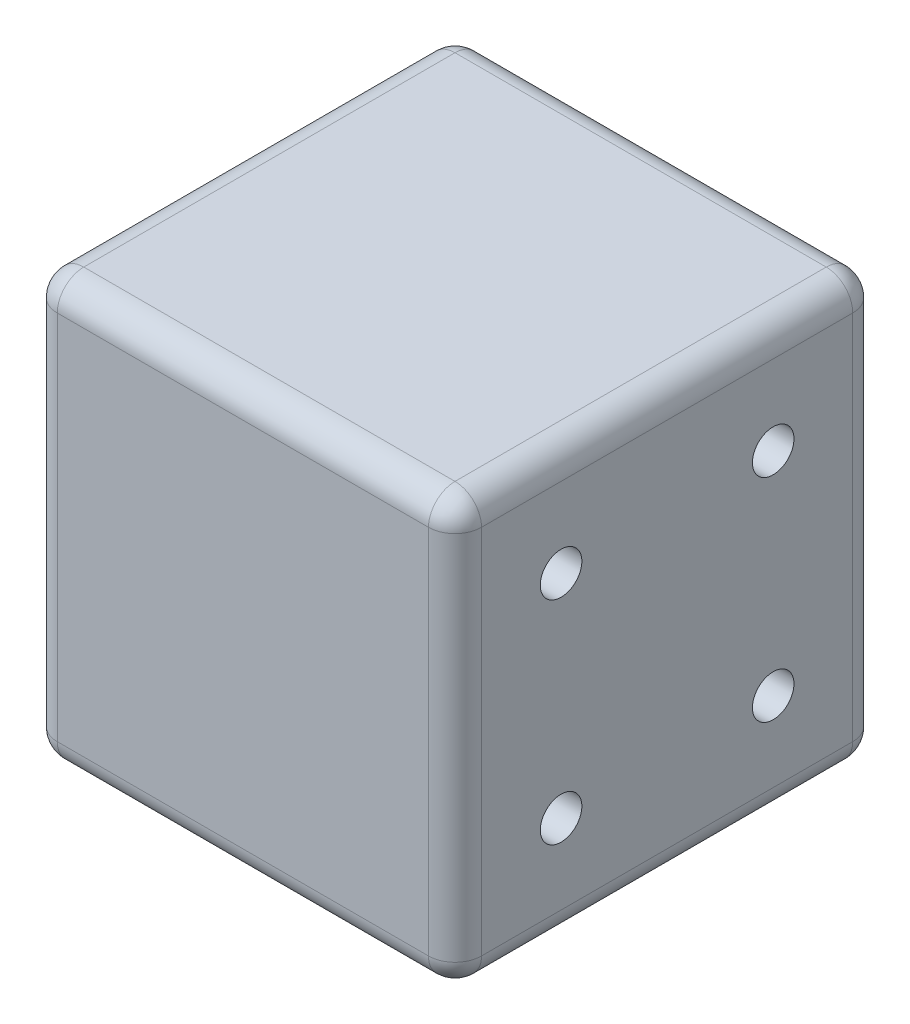
ISO-10303-21;
HEADER;
FILE_DESCRIPTION(('STEP AP214'),'2;1');
FILE_NAME('part.step','',(''),(''),'','','');
FILE_SCHEMA(('AUTOMOTIVE_DESIGN { 1 0 10303 214 1 1 1 1 }'));
ENDSEC;
DATA;
#1=APPLICATION_CONTEXT('core data for automotive mechanical design processes');
#2=APPLICATION_PROTOCOL_DEFINITION('international standard','automotive_design',2000,#1);
#3=PRODUCT_CONTEXT('',#1,'mechanical');
#4=PRODUCT('Part','Part','',(#3));
#5=PRODUCT_RELATED_PRODUCT_CATEGORY('part','',(#4));
#6=PRODUCT_DEFINITION_FORMATION('','',#4);
#7=PRODUCT_DEFINITION_CONTEXT('part definition',#1,'design');
#8=PRODUCT_DEFINITION('design','',#6,#7);
#9=PRODUCT_DEFINITION_SHAPE('','',#8);
#10=(LENGTH_UNIT() NAMED_UNIT(*) SI_UNIT(.MILLI.,.METRE.));
#11=(NAMED_UNIT(*) PLANE_ANGLE_UNIT() SI_UNIT($,.RADIAN.));
#12=(NAMED_UNIT(*) SI_UNIT($,.STERADIAN.) SOLID_ANGLE_UNIT());
#13=UNCERTAINTY_MEASURE_WITH_UNIT(LENGTH_MEASURE(1.E-05),#10,'distance_accuracy_value','');
#14=(GEOMETRIC_REPRESENTATION_CONTEXT(3) GLOBAL_UNCERTAINTY_ASSIGNED_CONTEXT((#13)) GLOBAL_UNIT_ASSIGNED_CONTEXT((#10,
#11,#12)) REPRESENTATION_CONTEXT('',''));
#15=CARTESIAN_POINT('',(0.,0.,0.));
#16=DIRECTION('',(0.,0.,1.));
#17=DIRECTION('',(1.,0.,0.));
#18=AXIS2_PLACEMENT_3D('',#15,#16,#17);
#19=CARTESIAN_POINT('',(0.,0.,-50.8));
#20=DIRECTION('',(-1.,0.,0.));
#21=DIRECTION('',(0.,0.,1.));
#22=AXIS2_PLACEMENT_3D('',#19,#20,#21);
#23=PLANE('',#22);
#24=CARTESIAN_POINT('',(0.,38.1,-38.1));
#25=DIRECTION('',(-1.,0.,0.));
#26=DIRECTION('',(0.,0.,1.));
#27=AXIS2_PLACEMENT_3D('',#24,#25,#26);
#28=CIRCLE('',#27,2.4892);
#29=CARTESIAN_POINT('',(0.,38.1,-35.6108));
#30=VERTEX_POINT('',#29);
#31=EDGE_CURVE('E428',#30,#30,#28,.T.);
#32=ORIENTED_EDGE('',*,*,#31,.F.);
#33=EDGE_LOOP('',(#32));
#34=FACE_BOUND('',#33,.T.);
#35=CARTESIAN_POINT('',(0.,38.1,-12.7));
#36=DIRECTION('',(-1.,0.,0.));
#37=DIRECTION('',(0.,0.,1.));
#38=AXIS2_PLACEMENT_3D('',#35,#36,#37);
#39=CIRCLE('',#38,2.4892);
#40=CARTESIAN_POINT('',(0.,38.1,-10.2108));
#41=VERTEX_POINT('',#40);
#42=EDGE_CURVE('E420',#41,#41,#39,.T.);
#43=ORIENTED_EDGE('',*,*,#42,.F.);
#44=EDGE_LOOP('',(#43));
#45=FACE_BOUND('',#44,.T.);
#46=CARTESIAN_POINT('',(0.,12.7,-12.7));
#47=DIRECTION('',(-1.,0.,0.));
#48=DIRECTION('',(0.,0.,1.));
#49=AXIS2_PLACEMENT_3D('',#46,#47,#48);
#50=CIRCLE('',#49,2.4892);
#51=CARTESIAN_POINT('',(0.,12.7,-10.2108));
#52=VERTEX_POINT('',#51);
#53=EDGE_CURVE('E416',#52,#52,#50,.T.);
#54=ORIENTED_EDGE('',*,*,#53,.F.);
#55=EDGE_LOOP('',(#54));
#56=FACE_BOUND('',#55,.T.);
#57=CARTESIAN_POINT('',(0.,12.7,-38.1));
#58=DIRECTION('',(-1.,0.,0.));
#59=DIRECTION('',(0.,0.,1.));
#60=AXIS2_PLACEMENT_3D('',#57,#58,#59);
#61=CIRCLE('',#60,2.4892);
#62=CARTESIAN_POINT('',(0.,12.7,-35.6108));
#63=VERTEX_POINT('',#62);
#64=EDGE_CURVE('E171',#63,#63,#61,.T.);
#65=ORIENTED_EDGE('',*,*,#64,.F.);
#66=EDGE_LOOP('',(#65));
#67=FACE_BOUND('',#66,.T.);
#68=DIRECTION('',(0.,-1.,0.));
#69=VECTOR('',#68,1.);
#70=CARTESIAN_POINT('',(0.,0.,-47.625));
#71=LINE('',#70,#69);
#72=CARTESIAN_POINT('',(0.,47.625,-47.625));
#73=VERTEX_POINT('',#72);
#74=CARTESIAN_POINT('',(0.,3.175,-47.625));
#75=VERTEX_POINT('',#74);
#76=EDGE_CURVE('E179',#73,#75,#71,.T.);
#77=ORIENTED_EDGE('',*,*,#76,.T.);
#78=DIRECTION('',(0.,0.,1.));
#79=VECTOR('',#78,1.);
#80=CARTESIAN_POINT('',(0.,3.175,-50.8));
#81=LINE('',#80,#79);
#82=CARTESIAN_POINT('',(0.,3.175,-3.175));
#83=VERTEX_POINT('',#82);
#84=EDGE_CURVE('E184',#75,#83,#81,.T.);
#85=ORIENTED_EDGE('',*,*,#84,.T.);
#86=DIRECTION('',(0.,-1.,0.));
#87=VECTOR('',#86,1.);
#88=CARTESIAN_POINT('',(0.,50.8,-3.175));
#89=LINE('',#88,#87);
#90=CARTESIAN_POINT('',(0.,47.625,-3.175));
#91=VERTEX_POINT('',#90);
#92=EDGE_CURVE('E181',#83,#91,#89,.F.);
#93=ORIENTED_EDGE('',*,*,#92,.T.);
#94=DIRECTION('',(0.,0.,1.));
#95=VECTOR('',#94,1.);
#96=CARTESIAN_POINT('',(0.,47.625,-50.8));
#97=LINE('',#96,#95);
#98=EDGE_CURVE('E177',#91,#73,#97,.F.);
#99=ORIENTED_EDGE('',*,*,#98,.T.);
#100=EDGE_LOOP('',(#77,#85,#93,#99));
#101=FACE_BOUND('',#100,.T.);
#102=ADVANCED_FACE('F39',(#34,#45,#56,#67,#101),#23,.T.);
#103=CARTESIAN_POINT('',(0.,50.8,-50.8));
#104=DIRECTION('',(0.,1.,0.));
#105=DIRECTION('',(0.,0.,1.));
#106=AXIS2_PLACEMENT_3D('',#103,#104,#105);
#107=PLANE('',#106);
#108=DIRECTION('',(0.,0.,1.));
#109=VECTOR('',#108,1.);
#110=CARTESIAN_POINT('',(47.625,50.8,-50.8));
#111=LINE('',#110,#109);
#112=CARTESIAN_POINT('',(47.625,50.8,-3.175));
#113=VERTEX_POINT('',#112);
#114=CARTESIAN_POINT('',(47.625,50.8,-47.625));
#115=VERTEX_POINT('',#114);
#116=EDGE_CURVE('E48',#113,#115,#111,.F.);
#117=ORIENTED_EDGE('',*,*,#116,.T.);
#118=DIRECTION('',(-1.,0.,0.));
#119=VECTOR('',#118,1.);
#120=CARTESIAN_POINT('',(0.,50.8,-47.625));
#121=LINE('',#120,#119);
#122=CARTESIAN_POINT('',(3.175,50.8,-47.625));
#123=VERTEX_POINT('',#122);
#124=EDGE_CURVE('E11',#115,#123,#121,.T.);
#125=ORIENTED_EDGE('',*,*,#124,.T.);
#126=DIRECTION('',(0.,0.,1.));
#127=VECTOR('',#126,1.);
#128=CARTESIAN_POINT('',(3.175,50.8,-50.8));
#129=LINE('',#128,#127);
#130=CARTESIAN_POINT('',(3.175,50.8,-3.175));
#131=VERTEX_POINT('',#130);
#132=EDGE_CURVE('E62',#123,#131,#129,.T.);
#133=ORIENTED_EDGE('',*,*,#132,.T.);
#134=DIRECTION('',(-1.,0.,0.));
#135=VECTOR('',#134,1.);
#136=CARTESIAN_POINT('',(50.8,50.8,-3.175));
#137=LINE('',#136,#135);
#138=EDGE_CURVE('E211',#131,#113,#137,.F.);
#139=ORIENTED_EDGE('',*,*,#138,.T.);
#140=EDGE_LOOP('',(#117,#125,#133,#139));
#141=FACE_BOUND('',#140,.T.);
#142=ADVANCED_FACE('F310',(#141),#107,.T.);
#143=CARTESIAN_POINT('',(50.8,0.,-50.8));
#144=DIRECTION('',(1.,0.,0.));
#145=DIRECTION('',(0.,1.,0.));
#146=AXIS2_PLACEMENT_3D('',#143,#144,#145);
#147=PLANE('',#146);
#148=CARTESIAN_POINT('',(50.8,38.1,-38.1));
#149=DIRECTION('',(-1.,0.,0.));
#150=DIRECTION('',(0.,0.,1.));
#151=AXIS2_PLACEMENT_3D('',#148,#149,#150);
#152=CIRCLE('',#151,2.4892);
#153=CARTESIAN_POINT('',(50.8,38.1,-35.6108));
#154=VERTEX_POINT('',#153);
#155=EDGE_CURVE('E431',#154,#154,#152,.T.);
#156=ORIENTED_EDGE('',*,*,#155,.T.);
#157=EDGE_LOOP('',(#156));
#158=FACE_BOUND('',#157,.T.);
#159=CARTESIAN_POINT('',(50.8,38.1,-12.7));
#160=DIRECTION('',(-1.,0.,0.));
#161=DIRECTION('',(0.,0.,1.));
#162=AXIS2_PLACEMENT_3D('',#159,#160,#161);
#163=CIRCLE('',#162,2.4892);
#164=CARTESIAN_POINT('',(50.8,38.1,-10.2108));
#165=VERTEX_POINT('',#164);
#166=EDGE_CURVE('E425',#165,#165,#163,.T.);
#167=ORIENTED_EDGE('',*,*,#166,.T.);
#168=EDGE_LOOP('',(#167));
#169=FACE_BOUND('',#168,.T.);
#170=CARTESIAN_POINT('',(50.8,12.7,-12.7));
#171=DIRECTION('',(-1.,0.,0.));
#172=DIRECTION('',(0.,0.,1.));
#173=AXIS2_PLACEMENT_3D('',#170,#171,#172);
#174=CIRCLE('',#173,2.4892);
#175=CARTESIAN_POINT('',(50.8,12.7,-10.2108));
#176=VERTEX_POINT('',#175);
#177=EDGE_CURVE('E413',#176,#176,#174,.T.);
#178=ORIENTED_EDGE('',*,*,#177,.T.);
#179=EDGE_LOOP('',(#178));
#180=FACE_BOUND('',#179,.T.);
#181=CARTESIAN_POINT('',(50.8,12.7,-38.1));
#182=DIRECTION('',(-1.,0.,0.));
#183=DIRECTION('',(0.,0.,1.));
#184=AXIS2_PLACEMENT_3D('',#181,#182,#183);
#185=CIRCLE('',#184,2.4892);
#186=CARTESIAN_POINT('',(50.8,12.7,-35.6108));
#187=VERTEX_POINT('',#186);
#188=EDGE_CURVE('E218',#187,#187,#185,.T.);
#189=ORIENTED_EDGE('',*,*,#188,.T.);
#190=EDGE_LOOP('',(#189));
#191=FACE_BOUND('',#190,.T.);
#192=DIRECTION('',(0.,1.,0.));
#193=VECTOR('',#192,1.);
#194=CARTESIAN_POINT('',(50.8,0.,-3.175));
#195=LINE('',#194,#193);
#196=CARTESIAN_POINT('',(50.8,47.625,-3.175));
#197=VERTEX_POINT('',#196);
#198=CARTESIAN_POINT('',(50.8,3.175,-3.175));
#199=VERTEX_POINT('',#198);
#200=EDGE_CURVE('E148',#197,#199,#195,.F.);
#201=ORIENTED_EDGE('',*,*,#200,.T.);
#202=DIRECTION('',(0.,0.,1.));
#203=VECTOR('',#202,1.);
#204=CARTESIAN_POINT('',(50.8,3.175,-50.8));
#205=LINE('',#204,#203);
#206=CARTESIAN_POINT('',(50.8,3.175,-47.625));
#207=VERTEX_POINT('',#206);
#208=EDGE_CURVE('E200',#199,#207,#205,.F.);
#209=ORIENTED_EDGE('',*,*,#208,.T.);
#210=DIRECTION('',(0.,1.,0.));
#211=VECTOR('',#210,1.);
#212=CARTESIAN_POINT('',(50.8,0.,-47.625));
#213=LINE('',#212,#211);
#214=CARTESIAN_POINT('',(50.8,47.625,-47.625));
#215=VERTEX_POINT('',#214);
#216=EDGE_CURVE('E197',#207,#215,#213,.T.);
#217=ORIENTED_EDGE('',*,*,#216,.T.);
#218=DIRECTION('',(0.,0.,1.));
#219=VECTOR('',#218,1.);
#220=CARTESIAN_POINT('',(50.8,47.625,-50.8));
#221=LINE('',#220,#219);
#222=EDGE_CURVE('E195',#215,#197,#221,.T.);
#223=ORIENTED_EDGE('',*,*,#222,.T.);
#224=EDGE_LOOP('',(#201,#209,#217,#223));
#225=FACE_BOUND('',#224,.T.);
#226=ADVANCED_FACE('F308',(#158,#169,#180,#191,#225),#147,.T.);
#227=CARTESIAN_POINT('',(0.,0.,-50.8));
#228=DIRECTION('',(0.,-1.,0.));
#229=DIRECTION('',(0.,0.,-1.));
#230=AXIS2_PLACEMENT_3D('',#227,#228,#229);
#231=PLANE('',#230);
#232=DIRECTION('',(1.,0.,0.));
#233=VECTOR('',#232,1.);
#234=CARTESIAN_POINT('',(0.,0.,-3.175));
#235=LINE('',#234,#233);
#236=CARTESIAN_POINT('',(47.625,0.,-3.175));
#237=VERTEX_POINT('',#236);
#238=CARTESIAN_POINT('',(3.175,0.,-3.175));
#239=VERTEX_POINT('',#238);
#240=EDGE_CURVE('E190',#237,#239,#235,.F.);
#241=ORIENTED_EDGE('',*,*,#240,.T.);
#242=DIRECTION('',(0.,0.,1.));
#243=VECTOR('',#242,1.);
#244=CARTESIAN_POINT('',(3.175,0.,-50.8));
#245=LINE('',#244,#243);
#246=CARTESIAN_POINT('',(3.175,0.,-47.625));
#247=VERTEX_POINT('',#246);
#248=EDGE_CURVE('E193',#239,#247,#245,.F.);
#249=ORIENTED_EDGE('',*,*,#248,.T.);
#250=DIRECTION('',(1.,0.,0.));
#251=VECTOR('',#250,1.);
#252=CARTESIAN_POINT('',(0.,0.,-47.625));
#253=LINE('',#252,#251);
#254=CARTESIAN_POINT('',(47.625,0.,-47.625));
#255=VERTEX_POINT('',#254);
#256=EDGE_CURVE('E188',#247,#255,#253,.T.);
#257=ORIENTED_EDGE('',*,*,#256,.T.);
#258=DIRECTION('',(0.,0.,1.));
#259=VECTOR('',#258,1.);
#260=CARTESIAN_POINT('',(47.625,0.,-50.8));
#261=LINE('',#260,#259);
#262=EDGE_CURVE('E186',#255,#237,#261,.T.);
#263=ORIENTED_EDGE('',*,*,#262,.T.);
#264=EDGE_LOOP('',(#241,#249,#257,#263));
#265=FACE_BOUND('',#264,.T.);
#266=ADVANCED_FACE('F277',(#265),#231,.T.);
#267=CARTESIAN_POINT('',(0.,0.,-50.8));
#268=DIRECTION('',(0.,0.,-1.));
#269=DIRECTION('',(-1.,0.,0.));
#270=AXIS2_PLACEMENT_3D('',#267,#268,#269);
#271=PLANE('',#270);
#272=DIRECTION('',(1.,0.,0.));
#273=VECTOR('',#272,1.);
#274=CARTESIAN_POINT('',(0.,3.175,-50.8));
#275=LINE('',#274,#273);
#276=CARTESIAN_POINT('',(47.625,3.175,-50.8));
#277=VERTEX_POINT('',#276);
#278=CARTESIAN_POINT('',(3.175,3.175,-50.8));
#279=VERTEX_POINT('',#278);
#280=EDGE_CURVE('E206',#277,#279,#275,.F.);
#281=ORIENTED_EDGE('',*,*,#280,.T.);
#282=DIRECTION('',(0.,-1.,0.));
#283=VECTOR('',#282,1.);
#284=CARTESIAN_POINT('',(3.175,0.,-50.8));
#285=LINE('',#284,#283);
#286=CARTESIAN_POINT('',(3.175,47.625,-50.8));
#287=VERTEX_POINT('',#286);
#288=EDGE_CURVE('E208',#279,#287,#285,.F.);
#289=ORIENTED_EDGE('',*,*,#288,.T.);
#290=DIRECTION('',(-1.,0.,0.));
#291=VECTOR('',#290,1.);
#292=CARTESIAN_POINT('',(0.,47.625,-50.8));
#293=LINE('',#292,#291);
#294=CARTESIAN_POINT('',(47.625,47.625,-50.8));
#295=VERTEX_POINT('',#294);
#296=EDGE_CURVE('E202',#287,#295,#293,.F.);
#297=ORIENTED_EDGE('',*,*,#296,.T.);
#298=DIRECTION('',(0.,1.,0.));
#299=VECTOR('',#298,1.);
#300=CARTESIAN_POINT('',(47.625,0.,-50.8));
#301=LINE('',#300,#299);
#302=EDGE_CURVE('E204',#295,#277,#301,.F.);
#303=ORIENTED_EDGE('',*,*,#302,.T.);
#304=EDGE_LOOP('',(#281,#289,#297,#303));
#305=FACE_BOUND('',#304,.T.);
#306=ADVANCED_FACE('F286',(#305),#271,.T.);
#307=CARTESIAN_POINT('',(0.,0.,0.));
#308=DIRECTION('',(0.,0.,-1.));
#309=DIRECTION('',(-1.,0.,0.));
#310=AXIS2_PLACEMENT_3D('',#307,#308,#309);
#311=PLANE('',#310);
#312=DIRECTION('',(-1.,0.,0.));
#313=VECTOR('',#312,1.);
#314=CARTESIAN_POINT('',(0.,47.625,0.));
#315=LINE('',#314,#313);
#316=CARTESIAN_POINT('',(47.625,47.625,0.));
#317=VERTEX_POINT('',#316);
#318=CARTESIAN_POINT('',(3.175,47.625,0.));
#319=VERTEX_POINT('',#318);
#320=EDGE_CURVE('E134',#317,#319,#315,.T.);
#321=ORIENTED_EDGE('',*,*,#320,.T.);
#322=DIRECTION('',(0.,-1.,0.));
#323=VECTOR('',#322,1.);
#324=CARTESIAN_POINT('',(3.175,0.,0.));
#325=LINE('',#324,#323);
#326=CARTESIAN_POINT('',(3.175,3.175,0.));
#327=VERTEX_POINT('',#326);
#328=EDGE_CURVE('E175',#319,#327,#325,.T.);
#329=ORIENTED_EDGE('',*,*,#328,.T.);
#330=DIRECTION('',(1.,0.,0.));
#331=VECTOR('',#330,1.);
#332=CARTESIAN_POINT('',(50.8,3.175,0.));
#333=LINE('',#332,#331);
#334=CARTESIAN_POINT('',(47.625,3.175,0.));
#335=VERTEX_POINT('',#334);
#336=EDGE_CURVE('E137',#327,#335,#333,.T.);
#337=ORIENTED_EDGE('',*,*,#336,.T.);
#338=DIRECTION('',(0.,1.,0.));
#339=VECTOR('',#338,1.);
#340=CARTESIAN_POINT('',(47.625,50.8,0.));
#341=LINE('',#340,#339);
#342=EDGE_CURVE('E129',#335,#317,#341,.T.);
#343=ORIENTED_EDGE('',*,*,#342,.T.);
#344=EDGE_LOOP('',(#321,#329,#337,#343));
#345=FACE_BOUND('',#344,.T.);
#346=ADVANCED_FACE('F131',(#345),#311,.F.);
#347=CARTESIAN_POINT('',(47.625,0.,-47.625));
#348=DIRECTION('',(0.,1.,0.));
#349=DIRECTION('',(-1.,0.,0.));
#350=AXIS2_PLACEMENT_3D('',#347,#348,#349);
#351=CYLINDRICAL_SURFACE('',#350,3.175);
#352=CARTESIAN_POINT('',(47.625,47.625,-47.625));
#353=DIRECTION('',(0.,1.,0.));
#354=DIRECTION('',(0.,0.,1.));
#355=AXIS2_PLACEMENT_3D('',#352,#353,#354);
#356=CIRCLE('',#355,3.175);
#357=EDGE_CURVE('E43',#215,#295,#356,.T.);
#358=ORIENTED_EDGE('',*,*,#357,.F.);
#359=ORIENTED_EDGE('',*,*,#216,.F.);
#360=CARTESIAN_POINT('',(47.625,3.175,-47.625));
#361=DIRECTION('',(0.,-1.,0.));
#362=DIRECTION('',(1.,0.,0.));
#363=AXIS2_PLACEMENT_3D('',#360,#361,#362);
#364=CIRCLE('',#363,3.175);
#365=EDGE_CURVE('E169',#277,#207,#364,.T.);
#366=ORIENTED_EDGE('',*,*,#365,.F.);
#367=ORIENTED_EDGE('',*,*,#302,.F.);
#368=EDGE_LOOP('',(#358,#359,#366,#367));
#369=FACE_BOUND('',#368,.T.);
#370=ADVANCED_FACE('F41',(#369),#351,.T.);
#371=CARTESIAN_POINT('',(47.625,47.625,-47.625));
#372=DIRECTION('',(0.,0.,-1.));
#373=DIRECTION('',(-1.,0.,0.));
#374=AXIS2_PLACEMENT_3D('',#371,#372,#373);
#375=SPHERICAL_SURFACE('',#374,3.175);
#376=CARTESIAN_POINT('',(47.625,47.625,-47.625));
#377=DIRECTION('',(0.,0.,-1.));
#378=DIRECTION('',(-1.,0.,0.));
#379=AXIS2_PLACEMENT_3D('',#376,#377,#378);
#380=CIRCLE('',#379,3.175);
#381=EDGE_CURVE('E256',#215,#115,#380,.F.);
#382=ORIENTED_EDGE('',*,*,#381,.F.);
#383=ORIENTED_EDGE('',*,*,#357,.T.);
#384=CARTESIAN_POINT('',(47.625,47.625,-47.625));
#385=DIRECTION('',(1.,0.,0.));
#386=DIRECTION('',(0.,0.,-1.));
#387=AXIS2_PLACEMENT_3D('',#384,#385,#386);
#388=CIRCLE('',#387,3.175);
#389=EDGE_CURVE('E258',#115,#295,#388,.F.);
#390=ORIENTED_EDGE('',*,*,#389,.F.);
#391=EDGE_LOOP('',(#382,#383,#390));
#392=FACE_BOUND('',#391,.T.);
#393=ADVANCED_FACE('F303',(#392),#375,.T.);
#394=CARTESIAN_POINT('',(47.625,3.175,-47.625));
#395=DIRECTION('',(1.,0.,0.));
#396=DIRECTION('',(0.,1.,0.));
#397=AXIS2_PLACEMENT_3D('',#394,#395,#396);
#398=SPHERICAL_SURFACE('',#397,3.175);
#399=CARTESIAN_POINT('',(47.625,3.175,-47.625));
#400=DIRECTION('',(1.,0.,0.));
#401=DIRECTION('',(0.,0.,-1.));
#402=AXIS2_PLACEMENT_3D('',#399,#400,#401);
#403=CIRCLE('',#402,3.175);
#404=EDGE_CURVE('E250',#277,#255,#403,.F.);
#405=ORIENTED_EDGE('',*,*,#404,.F.);
#406=ORIENTED_EDGE('',*,*,#365,.T.);
#407=CARTESIAN_POINT('',(47.625,3.175,-47.625));
#408=DIRECTION('',(0.,0.,-1.));
#409=DIRECTION('',(-1.,0.,0.));
#410=AXIS2_PLACEMENT_3D('',#407,#408,#409);
#411=CIRCLE('',#410,3.175);
#412=EDGE_CURVE('E253',#255,#207,#411,.F.);
#413=ORIENTED_EDGE('',*,*,#412,.F.);
#414=EDGE_LOOP('',(#405,#406,#413));
#415=FACE_BOUND('',#414,.T.);
#416=ADVANCED_FACE('F265',(#415),#398,.T.);
#417=CARTESIAN_POINT('',(0.,47.625,-47.625));
#418=DIRECTION('',(-1.,0.,0.));
#419=DIRECTION('',(0.,0.,1.));
#420=AXIS2_PLACEMENT_3D('',#417,#418,#419);
#421=CYLINDRICAL_SURFACE('',#420,3.175);
#422=ORIENTED_EDGE('',*,*,#389,.T.);
#423=ORIENTED_EDGE('',*,*,#296,.F.);
#424=CARTESIAN_POINT('',(3.175,47.625,-47.625));
#425=DIRECTION('',(-1.,0.,0.));
#426=DIRECTION('',(0.,0.,1.));
#427=AXIS2_PLACEMENT_3D('',#424,#425,#426);
#428=CIRCLE('',#427,3.175);
#429=EDGE_CURVE('E245',#123,#287,#428,.T.);
#430=ORIENTED_EDGE('',*,*,#429,.F.);
#431=ORIENTED_EDGE('',*,*,#124,.F.);
#432=EDGE_LOOP('',(#422,#423,#430,#431));
#433=FACE_BOUND('',#432,.T.);
#434=ADVANCED_FACE('F297',(#433),#421,.T.);
#435=CARTESIAN_POINT('',(47.625,47.625,-50.8));
#436=DIRECTION('',(0.,0.,1.));
#437=DIRECTION('',(1.,0.,0.));
#438=AXIS2_PLACEMENT_3D('',#435,#436,#437);
#439=CYLINDRICAL_SURFACE('',#438,3.175);
#440=ORIENTED_EDGE('',*,*,#381,.T.);
#441=ORIENTED_EDGE('',*,*,#116,.F.);
#442=CARTESIAN_POINT('',(47.625,47.625,-3.175));
#443=DIRECTION('',(0.,0.,1.));
#444=DIRECTION('',(1.,0.,0.));
#445=AXIS2_PLACEMENT_3D('',#442,#443,#444);
#446=CIRCLE('',#445,3.175);
#447=EDGE_CURVE('E152',#197,#113,#446,.T.);
#448=ORIENTED_EDGE('',*,*,#447,.F.);
#449=ORIENTED_EDGE('',*,*,#222,.F.);
#450=EDGE_LOOP('',(#440,#441,#448,#449));
#451=FACE_BOUND('',#450,.T.);
#452=ADVANCED_FACE('F306',(#451),#439,.T.);
#453=CARTESIAN_POINT('',(47.625,0.,-3.175));
#454=DIRECTION('',(0.,-1.,0.));
#455=DIRECTION('',(1.,0.,0.));
#456=AXIS2_PLACEMENT_3D('',#453,#454,#455);
#457=CYLINDRICAL_SURFACE('',#456,3.175);
#458=CARTESIAN_POINT('',(47.625,3.175,-3.175));
#459=DIRECTION('',(0.,-1.,0.));
#460=DIRECTION('',(1.,0.,0.));
#461=AXIS2_PLACEMENT_3D('',#458,#459,#460);
#462=CIRCLE('',#461,3.175);
#463=EDGE_CURVE('E153',#199,#335,#462,.T.);
#464=ORIENTED_EDGE('',*,*,#463,.F.);
#465=ORIENTED_EDGE('',*,*,#200,.F.);
#466=CARTESIAN_POINT('',(47.625,47.625,-3.175));
#467=DIRECTION('',(0.,1.,0.));
#468=DIRECTION('',(0.,0.,1.));
#469=AXIS2_PLACEMENT_3D('',#466,#467,#468);
#470=CIRCLE('',#469,3.175);
#471=EDGE_CURVE('E144',#317,#197,#470,.T.);
#472=ORIENTED_EDGE('',*,*,#471,.F.);
#473=ORIENTED_EDGE('',*,*,#342,.F.);
#474=EDGE_LOOP('',(#464,#465,#472,#473));
#475=FACE_BOUND('',#474,.T.);
#476=ADVANCED_FACE('F146',(#475),#457,.T.);
#477=CARTESIAN_POINT('',(47.625,3.175,-50.8));
#478=DIRECTION('',(0.,0.,1.));
#479=DIRECTION('',(1.,0.,0.));
#480=AXIS2_PLACEMENT_3D('',#477,#478,#479);
#481=CYLINDRICAL_SURFACE('',#480,3.175);
#482=ORIENTED_EDGE('',*,*,#412,.T.);
#483=ORIENTED_EDGE('',*,*,#208,.F.);
#484=CARTESIAN_POINT('',(47.625,3.175,-3.175));
#485=DIRECTION('',(0.,0.,1.));
#486=DIRECTION('',(1.,0.,0.));
#487=AXIS2_PLACEMENT_3D('',#484,#485,#486);
#488=CIRCLE('',#487,3.175);
#489=EDGE_CURVE('E241',#237,#199,#488,.T.);
#490=ORIENTED_EDGE('',*,*,#489,.F.);
#491=ORIENTED_EDGE('',*,*,#262,.F.);
#492=EDGE_LOOP('',(#482,#483,#490,#491));
#493=FACE_BOUND('',#492,.T.);
#494=ADVANCED_FACE('F273',(#493),#481,.T.);
#495=CARTESIAN_POINT('',(0.,3.175,-47.625));
#496=DIRECTION('',(1.,0.,0.));
#497=DIRECTION('',(0.,0.,-1.));
#498=AXIS2_PLACEMENT_3D('',#495,#496,#497);
#499=CYLINDRICAL_SURFACE('',#498,3.175);
#500=ORIENTED_EDGE('',*,*,#404,.T.);
#501=ORIENTED_EDGE('',*,*,#256,.F.);
#502=CARTESIAN_POINT('',(3.175,3.175,-47.625));
#503=DIRECTION('',(-1.,0.,0.));
#504=DIRECTION('',(0.,0.,1.));
#505=AXIS2_PLACEMENT_3D('',#502,#503,#504);
#506=CIRCLE('',#505,3.175);
#507=EDGE_CURVE('E238',#279,#247,#506,.T.);
#508=ORIENTED_EDGE('',*,*,#507,.F.);
#509=ORIENTED_EDGE('',*,*,#280,.F.);
#510=EDGE_LOOP('',(#500,#501,#508,#509));
#511=FACE_BOUND('',#510,.T.);
#512=ADVANCED_FACE('F283',(#511),#499,.T.);
#513=CARTESIAN_POINT('',(3.175,0.,-47.625));
#514=DIRECTION('',(0.,-1.,0.));
#515=DIRECTION('',(0.,0.,-1.));
#516=AXIS2_PLACEMENT_3D('',#513,#514,#515);
#517=CYLINDRICAL_SURFACE('',#516,3.175);
#518=CARTESIAN_POINT('',(3.175,47.625,-47.625));
#519=DIRECTION('',(0.,1.,0.));
#520=DIRECTION('',(0.,0.,1.));
#521=AXIS2_PLACEMENT_3D('',#518,#519,#520);
#522=CIRCLE('',#521,3.175);
#523=EDGE_CURVE('E247',#287,#73,#522,.T.);
#524=ORIENTED_EDGE('',*,*,#523,.F.);
#525=ORIENTED_EDGE('',*,*,#288,.F.);
#526=CARTESIAN_POINT('',(3.175,3.175,-47.625));
#527=DIRECTION('',(0.,-1.,0.));
#528=DIRECTION('',(0.,0.,-1.));
#529=AXIS2_PLACEMENT_3D('',#526,#527,#528);
#530=CIRCLE('',#529,3.175);
#531=EDGE_CURVE('E235',#75,#279,#530,.T.);
#532=ORIENTED_EDGE('',*,*,#531,.F.);
#533=ORIENTED_EDGE('',*,*,#76,.F.);
#534=EDGE_LOOP('',(#524,#525,#532,#533));
#535=FACE_BOUND('',#534,.T.);
#536=ADVANCED_FACE('F290',(#535),#517,.T.);
#537=CARTESIAN_POINT('',(3.175,47.625,-47.625));
#538=DIRECTION('',(0.,0.,-1.));
#539=DIRECTION('',(-1.,0.,0.));
#540=AXIS2_PLACEMENT_3D('',#537,#538,#539);
#541=SPHERICAL_SURFACE('',#540,3.175);
#542=ORIENTED_EDGE('',*,*,#429,.T.);
#543=ORIENTED_EDGE('',*,*,#523,.T.);
#544=CARTESIAN_POINT('',(3.175,47.625,-47.625));
#545=DIRECTION('',(0.,0.,-1.));
#546=DIRECTION('',(-1.,0.,0.));
#547=AXIS2_PLACEMENT_3D('',#544,#545,#546);
#548=CIRCLE('',#547,3.175);
#549=EDGE_CURVE('E160',#123,#73,#548,.F.);
#550=ORIENTED_EDGE('',*,*,#549,.F.);
#551=EDGE_LOOP('',(#542,#543,#550));
#552=FACE_BOUND('',#551,.T.);
#553=ADVANCED_FACE('F366',(#552),#541,.T.);
#554=CARTESIAN_POINT('',(47.625,47.625,-3.175));
#555=DIRECTION('',(1.,0.,0.));
#556=DIRECTION('',(0.,0.,-1.));
#557=AXIS2_PLACEMENT_3D('',#554,#555,#556);
#558=SPHERICAL_SURFACE('',#557,3.175);
#559=ORIENTED_EDGE('',*,*,#471,.T.);
#560=ORIENTED_EDGE('',*,*,#447,.T.);
#561=CARTESIAN_POINT('',(47.625,47.625,-3.175));
#562=DIRECTION('',(1.,0.,0.));
#563=DIRECTION('',(0.,0.,-1.));
#564=AXIS2_PLACEMENT_3D('',#561,#562,#563);
#565=CIRCLE('',#564,3.175);
#566=EDGE_CURVE('E156',#317,#113,#565,.F.);
#567=ORIENTED_EDGE('',*,*,#566,.F.);
#568=EDGE_LOOP('',(#559,#560,#567));
#569=FACE_BOUND('',#568,.T.);
#570=ADVANCED_FACE('F157',(#569),#558,.T.);
#571=CARTESIAN_POINT('',(47.625,3.175,-3.175));
#572=DIRECTION('',(1.,0.,0.));
#573=DIRECTION('',(0.,1.,0.));
#574=AXIS2_PLACEMENT_3D('',#571,#572,#573);
#575=SPHERICAL_SURFACE('',#574,3.175);
#576=ORIENTED_EDGE('',*,*,#489,.T.);
#577=ORIENTED_EDGE('',*,*,#463,.T.);
#578=CARTESIAN_POINT('',(47.625,3.175,-3.175));
#579=DIRECTION('',(1.,0.,0.));
#580=DIRECTION('',(0.,0.,-1.));
#581=AXIS2_PLACEMENT_3D('',#578,#579,#580);
#582=CIRCLE('',#581,3.175);
#583=EDGE_CURVE('E161',#237,#335,#582,.F.);
#584=ORIENTED_EDGE('',*,*,#583,.F.);
#585=EDGE_LOOP('',(#576,#577,#584));
#586=FACE_BOUND('',#585,.T.);
#587=ADVANCED_FACE('F359',(#586),#575,.T.);
#588=CARTESIAN_POINT('',(3.175,3.175,-47.625));
#589=DIRECTION('',(0.,0.,-1.));
#590=DIRECTION('',(-1.,0.,0.));
#591=AXIS2_PLACEMENT_3D('',#588,#589,#590);
#592=SPHERICAL_SURFACE('',#591,3.175);
#593=ORIENTED_EDGE('',*,*,#531,.T.);
#594=ORIENTED_EDGE('',*,*,#507,.T.);
#595=CARTESIAN_POINT('',(3.175,3.175,-47.625));
#596=DIRECTION('',(0.,0.,-1.));
#597=DIRECTION('',(-1.,0.,0.));
#598=AXIS2_PLACEMENT_3D('',#595,#596,#597);
#599=CIRCLE('',#598,3.175);
#600=EDGE_CURVE('E229',#75,#247,#599,.F.);
#601=ORIENTED_EDGE('',*,*,#600,.F.);
#602=EDGE_LOOP('',(#593,#594,#601));
#603=FACE_BOUND('',#602,.T.);
#604=ADVANCED_FACE('F356',(#603),#592,.T.);
#605=CARTESIAN_POINT('',(3.175,47.625,-50.8));
#606=DIRECTION('',(0.,0.,1.));
#607=DIRECTION('',(1.,0.,0.));
#608=AXIS2_PLACEMENT_3D('',#605,#606,#607);
#609=CYLINDRICAL_SURFACE('',#608,3.175);
#610=ORIENTED_EDGE('',*,*,#549,.T.);
#611=ORIENTED_EDGE('',*,*,#98,.F.);
#612=CARTESIAN_POINT('',(3.175,47.625,-3.175));
#613=DIRECTION('',(0.,0.,1.));
#614=DIRECTION('',(1.,0.,0.));
#615=AXIS2_PLACEMENT_3D('',#612,#613,#614);
#616=CIRCLE('',#615,3.175);
#617=EDGE_CURVE('E226',#131,#91,#616,.T.);
#618=ORIENTED_EDGE('',*,*,#617,.F.);
#619=ORIENTED_EDGE('',*,*,#132,.F.);
#620=EDGE_LOOP('',(#610,#611,#618,#619));
#621=FACE_BOUND('',#620,.T.);
#622=ADVANCED_FACE('F353',(#621),#609,.T.);
#623=CARTESIAN_POINT('',(0.,47.625,-3.175));
#624=DIRECTION('',(1.,0.,0.));
#625=DIRECTION('',(0.,0.,-1.));
#626=AXIS2_PLACEMENT_3D('',#623,#624,#625);
#627=CYLINDRICAL_SURFACE('',#626,3.175);
#628=ORIENTED_EDGE('',*,*,#566,.T.);
#629=ORIENTED_EDGE('',*,*,#138,.F.);
#630=CARTESIAN_POINT('',(3.175,47.625,-3.175));
#631=DIRECTION('',(-1.,0.,0.));
#632=DIRECTION('',(0.,0.,1.));
#633=AXIS2_PLACEMENT_3D('',#630,#631,#632);
#634=CIRCLE('',#633,3.175);
#635=EDGE_CURVE('E165',#319,#131,#634,.T.);
#636=ORIENTED_EDGE('',*,*,#635,.F.);
#637=ORIENTED_EDGE('',*,*,#320,.F.);
#638=EDGE_LOOP('',(#628,#629,#636,#637));
#639=FACE_BOUND('',#638,.T.);
#640=ADVANCED_FACE('F163',(#639),#627,.T.);
#641=CARTESIAN_POINT('',(0.,3.175,-3.175));
#642=DIRECTION('',(-1.,0.,0.));
#643=DIRECTION('',(0.,0.,1.));
#644=AXIS2_PLACEMENT_3D('',#641,#642,#643);
#645=CYLINDRICAL_SURFACE('',#644,3.175);
#646=ORIENTED_EDGE('',*,*,#583,.T.);
#647=ORIENTED_EDGE('',*,*,#336,.F.);
#648=CARTESIAN_POINT('',(3.175,3.175,-3.175));
#649=DIRECTION('',(-1.,0.,0.));
#650=DIRECTION('',(0.,0.,1.));
#651=AXIS2_PLACEMENT_3D('',#648,#649,#650);
#652=CIRCLE('',#651,3.175);
#653=EDGE_CURVE('E222',#239,#327,#652,.T.);
#654=ORIENTED_EDGE('',*,*,#653,.F.);
#655=ORIENTED_EDGE('',*,*,#240,.F.);
#656=EDGE_LOOP('',(#646,#647,#654,#655));
#657=FACE_BOUND('',#656,.T.);
#658=ADVANCED_FACE('F346',(#657),#645,.T.);
#659=CARTESIAN_POINT('',(3.175,3.175,-50.8));
#660=DIRECTION('',(0.,0.,1.));
#661=DIRECTION('',(1.,0.,0.));
#662=AXIS2_PLACEMENT_3D('',#659,#660,#661);
#663=CYLINDRICAL_SURFACE('',#662,3.175);
#664=ORIENTED_EDGE('',*,*,#600,.T.);
#665=ORIENTED_EDGE('',*,*,#248,.F.);
#666=CARTESIAN_POINT('',(3.175,3.175,-3.175));
#667=DIRECTION('',(0.,0.,1.));
#668=DIRECTION('',(1.,0.,0.));
#669=AXIS2_PLACEMENT_3D('',#666,#667,#668);
#670=CIRCLE('',#669,3.175);
#671=EDGE_CURVE('E220',#83,#239,#670,.T.);
#672=ORIENTED_EDGE('',*,*,#671,.F.);
#673=ORIENTED_EDGE('',*,*,#84,.F.);
#674=EDGE_LOOP('',(#664,#665,#672,#673));
#675=FACE_BOUND('',#674,.T.);
#676=ADVANCED_FACE('F342',(#675),#663,.T.);
#677=CARTESIAN_POINT('',(3.175,47.625,-3.175));
#678=DIRECTION('',(0.,1.,0.));
#679=DIRECTION('',(0.,0.,1.));
#680=AXIS2_PLACEMENT_3D('',#677,#678,#679);
#681=SPHERICAL_SURFACE('',#680,3.175);
#682=ORIENTED_EDGE('',*,*,#635,.T.);
#683=ORIENTED_EDGE('',*,*,#617,.T.);
#684=CARTESIAN_POINT('',(3.175,47.625,-3.175));
#685=DIRECTION('',(0.,1.,0.));
#686=DIRECTION('',(0.,0.,1.));
#687=AXIS2_PLACEMENT_3D('',#684,#685,#686);
#688=CIRCLE('',#687,3.175);
#689=EDGE_CURVE('E217',#319,#91,#688,.F.);
#690=ORIENTED_EDGE('',*,*,#689,.F.);
#691=EDGE_LOOP('',(#682,#683,#690));
#692=FACE_BOUND('',#691,.T.);
#693=ADVANCED_FACE('F338',(#692),#681,.T.);
#694=CARTESIAN_POINT('',(3.175,3.175,-3.175));
#695=DIRECTION('',(0.,-1.,0.));
#696=DIRECTION('',(0.,0.,-1.));
#697=AXIS2_PLACEMENT_3D('',#694,#695,#696);
#698=SPHERICAL_SURFACE('',#697,3.175);
#699=ORIENTED_EDGE('',*,*,#671,.T.);
#700=ORIENTED_EDGE('',*,*,#653,.T.);
#701=CARTESIAN_POINT('',(3.175,3.175,-3.175));
#702=DIRECTION('',(0.,-1.,0.));
#703=DIRECTION('',(0.,0.,-1.));
#704=AXIS2_PLACEMENT_3D('',#701,#702,#703);
#705=CIRCLE('',#704,3.175);
#706=EDGE_CURVE('E215',#83,#327,#705,.F.);
#707=ORIENTED_EDGE('',*,*,#706,.F.);
#708=EDGE_LOOP('',(#699,#700,#707));
#709=FACE_BOUND('',#708,.T.);
#710=ADVANCED_FACE('F334',(#709),#698,.T.);
#711=CARTESIAN_POINT('',(3.175,0.,-3.175));
#712=DIRECTION('',(0.,1.,0.));
#713=DIRECTION('',(0.,0.,1.));
#714=AXIS2_PLACEMENT_3D('',#711,#712,#713);
#715=CYLINDRICAL_SURFACE('',#714,3.175);
#716=ORIENTED_EDGE('',*,*,#689,.T.);
#717=ORIENTED_EDGE('',*,*,#92,.F.);
#718=ORIENTED_EDGE('',*,*,#706,.T.);
#719=ORIENTED_EDGE('',*,*,#328,.F.);
#720=EDGE_LOOP('',(#716,#717,#718,#719));
#721=FACE_BOUND('',#720,.T.);
#722=ADVANCED_FACE('F331',(#721),#715,.T.);
#723=CARTESIAN_POINT('',(50.8,12.7,-38.1));
#724=DIRECTION('',(-1.,0.,0.));
#725=DIRECTION('',(0.,0.,1.));
#726=AXIS2_PLACEMENT_3D('',#723,#724,#725);
#727=CYLINDRICAL_SURFACE('',#726,2.4892);
#728=ORIENTED_EDGE('',*,*,#188,.F.);
#729=EDGE_LOOP('',(#728));
#730=FACE_BOUND('',#729,.T.);
#731=ORIENTED_EDGE('',*,*,#64,.T.);
#732=EDGE_LOOP('',(#731));
#733=FACE_BOUND('',#732,.T.);
#734=ADVANCED_FACE('F333',(#730,#733),#727,.F.);
#735=CARTESIAN_POINT('',(50.8,12.7,-12.7));
#736=DIRECTION('',(-1.,0.,0.));
#737=DIRECTION('',(0.,0.,1.));
#738=AXIS2_PLACEMENT_3D('',#735,#736,#737);
#739=CYLINDRICAL_SURFACE('',#738,2.4892);
#740=ORIENTED_EDGE('',*,*,#177,.F.);
#741=EDGE_LOOP('',(#740));
#742=FACE_BOUND('',#741,.T.);
#743=ORIENTED_EDGE('',*,*,#53,.T.);
#744=EDGE_LOOP('',(#743));
#745=FACE_BOUND('',#744,.T.);
#746=ADVANCED_FACE('F396',(#742,#745),#739,.F.);
#747=CARTESIAN_POINT('',(50.8,38.1,-12.7));
#748=DIRECTION('',(-1.,0.,0.));
#749=DIRECTION('',(0.,0.,1.));
#750=AXIS2_PLACEMENT_3D('',#747,#748,#749);
#751=CYLINDRICAL_SURFACE('',#750,2.4892);
#752=ORIENTED_EDGE('',*,*,#166,.F.);
#753=EDGE_LOOP('',(#752));
#754=FACE_BOUND('',#753,.T.);
#755=ORIENTED_EDGE('',*,*,#42,.T.);
#756=EDGE_LOOP('',(#755));
#757=FACE_BOUND('',#756,.T.);
#758=ADVANCED_FACE('F401',(#754,#757),#751,.F.);
#759=CARTESIAN_POINT('',(50.8,38.1,-38.1));
#760=DIRECTION('',(-1.,0.,0.));
#761=DIRECTION('',(0.,0.,1.));
#762=AXIS2_PLACEMENT_3D('',#759,#760,#761);
#763=CYLINDRICAL_SURFACE('',#762,2.4892);
#764=ORIENTED_EDGE('',*,*,#155,.F.);
#765=EDGE_LOOP('',(#764));
#766=FACE_BOUND('',#765,.T.);
#767=ORIENTED_EDGE('',*,*,#31,.T.);
#768=EDGE_LOOP('',(#767));
#769=FACE_BOUND('',#768,.T.);
#770=ADVANCED_FACE('F398',(#766,#769),#763,.F.);
#771=CLOSED_SHELL('',(#102,#142,#226,#266,#306,#346,#370,#393,#416,#434,#452,#476,#494,#512,
#536,#553,#570,#587,#604,#622,#640,#658,#676,#693,#710,#722,#734,#746,#758,#770));
#772=MANIFOLD_SOLID_BREP('B2',#771);
#773=ADVANCED_BREP_SHAPE_REPRESENTATION('',(#18,#772),#14);
#774=SHAPE_DEFINITION_REPRESENTATION(#9,#773);
ENDSEC;
END-ISO-10303-21;
